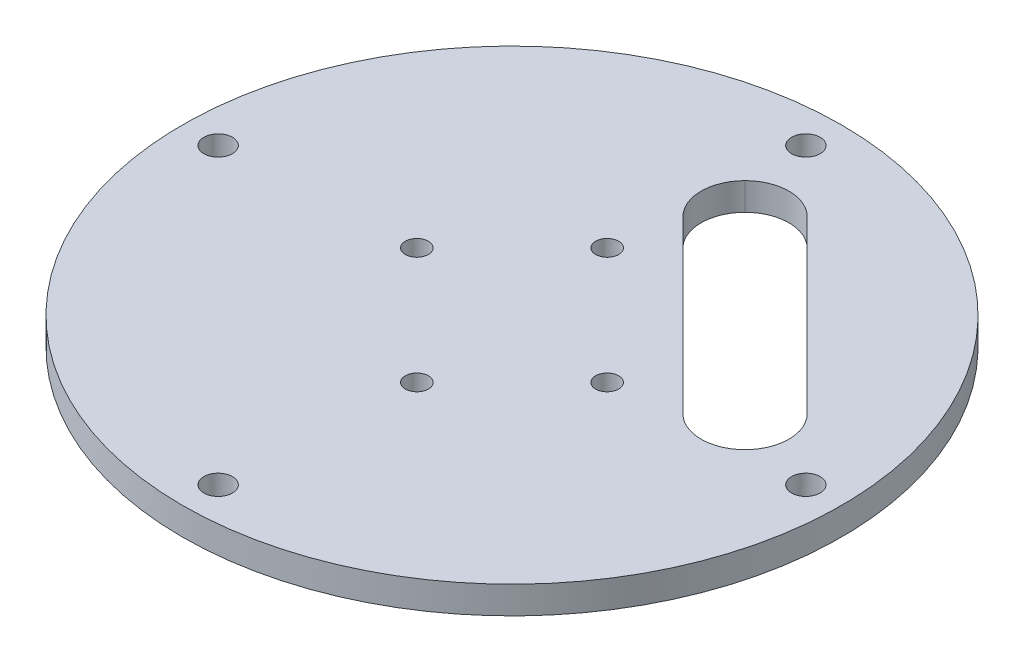
ISO-10303-21;
HEADER;
FILE_DESCRIPTION(('STEP AP214'),'2;1');
FILE_NAME('part.step','',(''),(''),'','','');
FILE_SCHEMA(('AUTOMOTIVE_DESIGN { 1 0 10303 214 1 1 1 1 }'));
ENDSEC;
DATA;
#1=APPLICATION_CONTEXT('core data for automotive mechanical design processes');
#2=APPLICATION_PROTOCOL_DEFINITION('international standard','automotive_design',2000,#1);
#3=PRODUCT_CONTEXT('',#1,'mechanical');
#4=PRODUCT('Part','Part','',(#3));
#5=PRODUCT_RELATED_PRODUCT_CATEGORY('part','',(#4));
#6=PRODUCT_DEFINITION_FORMATION('','',#4);
#7=PRODUCT_DEFINITION_CONTEXT('part definition',#1,'design');
#8=PRODUCT_DEFINITION('design','',#6,#7);
#9=PRODUCT_DEFINITION_SHAPE('','',#8);
#10=(LENGTH_UNIT() NAMED_UNIT(*) SI_UNIT(.MILLI.,.METRE.));
#11=(NAMED_UNIT(*) PLANE_ANGLE_UNIT() SI_UNIT($,.RADIAN.));
#12=(NAMED_UNIT(*) SI_UNIT($,.STERADIAN.) SOLID_ANGLE_UNIT());
#13=UNCERTAINTY_MEASURE_WITH_UNIT(LENGTH_MEASURE(1.E-05),#10,'distance_accuracy_value','');
#14=(GEOMETRIC_REPRESENTATION_CONTEXT(3) GLOBAL_UNCERTAINTY_ASSIGNED_CONTEXT((#13)) GLOBAL_UNIT_ASSIGNED_CONTEXT((#10,
#11,#12)) REPRESENTATION_CONTEXT('',''));
#15=CARTESIAN_POINT('',(0.,0.,0.));
#16=DIRECTION('',(0.,0.,1.));
#17=DIRECTION('',(1.,0.,0.));
#18=AXIS2_PLACEMENT_3D('',#15,#16,#17);
#19=CARTESIAN_POINT('',(0.,5.,0.));
#20=DIRECTION('',(0.,1.,0.));
#21=DIRECTION('',(0.,0.,1.));
#22=AXIS2_PLACEMENT_3D('',#19,#20,#21);
#23=PLANE('',#22);
#24=DIRECTION('',(0.707106781186549,0.,0.707106781186546));
#25=VECTOR('',#24,1.);
#26=CARTESIAN_POINT('',(-5.65685424949306,5.,-36.7695526217011));
#27=LINE('',#26,#25);
#28=CARTESIAN_POINT('',(-6.69603261727048E-13,5.,-31.1126983722087));
#29=VERTEX_POINT('',#28);
#30=CARTESIAN_POINT('',(31.1126983722081,5.,0.));
#31=VERTEX_POINT('',#30);
#32=EDGE_CURVE('E150',#29,#31,#27,.T.);
#33=ORIENTED_EDGE('',*,*,#32,.F.);
#34=CARTESIAN_POINT('',(5.6568542494917,5.,-36.7695526217011));
#35=DIRECTION('',(0.,1.,0.));
#36=DIRECTION('',(0.,0.,1.));
#37=AXIS2_PLACEMENT_3D('',#34,#35,#36);
#38=CIRCLE('',#37,8.);
#39=CARTESIAN_POINT('',(-6.83481049534862E-13,5.,-42.4264068711935));
#40=VERTEX_POINT('',#39);
#41=EDGE_CURVE('E11',#29,#40,#38,.F.);
#42=ORIENTED_EDGE('',*,*,#41,.T.);
#43=CARTESIAN_POINT('',(5.65685424949171,5.,-36.7695526217011));
#44=DIRECTION('',(0.,1.,0.));
#45=DIRECTION('',(0.,0.,1.));
#46=AXIS2_PLACEMENT_3D('',#43,#44,#45);
#47=CIRCLE('',#46,8.);
#48=CARTESIAN_POINT('',(11.3137084989841,5.,-42.4264068711935));
#49=VERTEX_POINT('',#48);
#50=EDGE_CURVE('E94',#40,#49,#47,.F.);
#51=ORIENTED_EDGE('',*,*,#50,.T.);
#52=DIRECTION('',(-0.707106781186549,0.,-0.707106781186546));
#53=VECTOR('',#52,1.);
#54=CARTESIAN_POINT('',(5.65685424949169,5.,-48.0832611206859));
#55=LINE('',#54,#53);
#56=CARTESIAN_POINT('',(42.4264068711928,5.,-11.3137084989848));
#57=VERTEX_POINT('',#56);
#58=EDGE_CURVE('E143',#57,#49,#55,.T.);
#59=ORIENTED_EDGE('',*,*,#58,.F.);
#60=CARTESIAN_POINT('',(36.7695526217005,5.,-5.65685424949246));
#61=DIRECTION('',(0.,1.,0.));
#62=DIRECTION('',(0.,0.,1.));
#63=AXIS2_PLACEMENT_3D('',#60,#61,#62);
#64=CIRCLE('',#63,8.);
#65=CARTESIAN_POINT('',(42.4264068711928,5.,0.));
#66=VERTEX_POINT('',#65);
#67=EDGE_CURVE('E125',#57,#66,#64,.F.);
#68=ORIENTED_EDGE('',*,*,#67,.T.);
#69=CARTESIAN_POINT('',(36.7695526217004,5.,-5.65685424949245));
#70=DIRECTION('',(0.,1.,0.));
#71=DIRECTION('',(0.,0.,1.));
#72=AXIS2_PLACEMENT_3D('',#69,#70,#71);
#73=CIRCLE('',#72,8.);
#74=EDGE_CURVE('E121',#66,#31,#73,.F.);
#75=ORIENTED_EDGE('',*,*,#74,.T.);
#76=EDGE_LOOP('',(#33,#42,#51,#59,#68,#75));
#77=FACE_BOUND('',#76,.T.);
#78=CARTESIAN_POINT('',(1.94454364826355,5.,19.2686597873333));
#79=DIRECTION('',(0.,1.,0.));
#80=DIRECTION('',(0.,0.,1.));
#81=AXIS2_PLACEMENT_3D('',#78,#79,#80);
#82=CIRCLE('',#81,2.1);
#83=CARTESIAN_POINT('',(1.94454364826355,5.,21.3686597873333));
#84=VERTEX_POINT('',#83);
#85=EDGE_CURVE('E153',#84,#84,#82,.T.);
#86=ORIENTED_EDGE('',*,*,#85,.F.);
#87=EDGE_LOOP('',(#86));
#88=FACE_BOUND('',#87,.T.);
#89=CARTESIAN_POINT('',(-1.94454364826314,5.,-19.2686597873333));
#90=DIRECTION('',(0.,1.,0.));
#91=DIRECTION('',(0.,0.,1.));
#92=AXIS2_PLACEMENT_3D('',#89,#90,#91);
#93=CIRCLE('',#92,2.1);
#94=CARTESIAN_POINT('',(-1.94454364826314,5.,-17.1686597873333));
#95=VERTEX_POINT('',#94);
#96=EDGE_CURVE('E167',#95,#95,#93,.T.);
#97=ORIENTED_EDGE('',*,*,#96,.F.);
#98=EDGE_LOOP('',(#97));
#99=FACE_BOUND('',#98,.T.);
#100=CARTESIAN_POINT('',(0.,5.,53.5));
#101=DIRECTION('',(0.,1.,0.));
#102=DIRECTION('',(0.,0.,-1.));
#103=AXIS2_PLACEMENT_3D('',#100,#101,#102);
#104=CIRCLE('',#103,2.6);
#105=CARTESIAN_POINT('',(0.,5.,50.9));
#106=VERTEX_POINT('',#105);
#107=EDGE_CURVE('E179',#106,#106,#104,.T.);
#108=ORIENTED_EDGE('',*,*,#107,.F.);
#109=EDGE_LOOP('',(#108));
#110=FACE_BOUND('',#109,.T.);
#111=CARTESIAN_POINT('',(0.,5.,-53.5));
#112=DIRECTION('',(0.,1.,0.));
#113=DIRECTION('',(0.,0.,1.));
#114=AXIS2_PLACEMENT_3D('',#111,#112,#113);
#115=CIRCLE('',#114,2.6);
#116=CARTESIAN_POINT('',(0.,5.,-50.9));
#117=VERTEX_POINT('',#116);
#118=EDGE_CURVE('E191',#117,#117,#115,.T.);
#119=ORIENTED_EDGE('',*,*,#118,.F.);
#120=EDGE_LOOP('',(#119));
#121=FACE_BOUND('',#120,.T.);
#122=CARTESIAN_POINT('',(0.,5.,0.));
#123=DIRECTION('',(0.,1.,0.));
#124=DIRECTION('',(0.,0.,1.));
#125=AXIS2_PLACEMENT_3D('',#122,#123,#124);
#126=CIRCLE('',#125,60.);
#127=CARTESIAN_POINT('',(0.,5.,60.));
#128=VERTEX_POINT('',#127);
#129=EDGE_CURVE('E106',#128,#128,#126,.T.);
#130=ORIENTED_EDGE('',*,*,#129,.T.);
#131=EDGE_LOOP('',(#130));
#132=FACE_BOUND('',#131,.T.);
#133=CARTESIAN_POINT('',(53.5,5.,-1.80411241501588E-13));
#134=DIRECTION('',(0.,1.,0.));
#135=DIRECTION('',(0.,0.,-1.));
#136=AXIS2_PLACEMENT_3D('',#133,#134,#135);
#137=CIRCLE('',#136,2.6);
#138=CARTESIAN_POINT('',(53.5,5.,-2.60000000000018));
#139=VERTEX_POINT('',#138);
#140=EDGE_CURVE('E185',#139,#139,#137,.T.);
#141=ORIENTED_EDGE('',*,*,#140,.F.);
#142=EDGE_LOOP('',(#141));
#143=FACE_BOUND('',#142,.T.);
#144=CARTESIAN_POINT('',(-53.5,5.,-1.80411241501588E-13));
#145=DIRECTION('',(0.,1.,0.));
#146=DIRECTION('',(0.,0.,1.));
#147=AXIS2_PLACEMENT_3D('',#144,#145,#146);
#148=CIRCLE('',#147,2.6);
#149=CARTESIAN_POINT('',(-53.5,5.,2.59999999999982));
#150=VERTEX_POINT('',#149);
#151=EDGE_CURVE('E173',#150,#150,#148,.T.);
#152=ORIENTED_EDGE('',*,*,#151,.F.);
#153=EDGE_LOOP('',(#152));
#154=FACE_BOUND('',#153,.T.);
#155=CARTESIAN_POINT('',(19.2686597873333,5.,1.94454364826308));
#156=DIRECTION('',(0.,1.,0.));
#157=DIRECTION('',(0.,0.,-1.));
#158=AXIS2_PLACEMENT_3D('',#155,#156,#157);
#159=CIRCLE('',#158,2.1);
#160=CARTESIAN_POINT('',(19.2686597873333,5.,-0.155456351736919));
#161=VERTEX_POINT('',#160);
#162=EDGE_CURVE('E161',#161,#161,#159,.T.);
#163=ORIENTED_EDGE('',*,*,#162,.F.);
#164=EDGE_LOOP('',(#163));
#165=FACE_BOUND('',#164,.T.);
#166=CARTESIAN_POINT('',(-19.2686597873334,5.,-1.94454364826267));
#167=DIRECTION('',(0.,1.,0.));
#168=DIRECTION('',(0.,0.,-1.));
#169=AXIS2_PLACEMENT_3D('',#166,#167,#168);
#170=CIRCLE('',#169,2.1);
#171=CARTESIAN_POINT('',(-19.2686597873334,5.,-4.04454364826267));
#172=VERTEX_POINT('',#171);
#173=EDGE_CURVE('E104',#172,#172,#170,.T.);
#174=ORIENTED_EDGE('',*,*,#173,.F.);
#175=EDGE_LOOP('',(#174));
#176=FACE_BOUND('',#175,.T.);
#177=ADVANCED_FACE('F35',(#77,#88,#99,#110,#121,#132,#143,#154,#165,#176),#23,.T.);
#178=CARTESIAN_POINT('',(0.,0.,0.));
#179=DIRECTION('',(0.,1.,0.));
#180=DIRECTION('',(0.,0.,1.));
#181=AXIS2_PLACEMENT_3D('',#178,#179,#180);
#182=PLANE('',#181);
#183=CARTESIAN_POINT('',(1.94454364826355,0.,19.2686597873333));
#184=DIRECTION('',(0.,1.,0.));
#185=DIRECTION('',(0.,0.,1.));
#186=AXIS2_PLACEMENT_3D('',#183,#184,#185);
#187=CIRCLE('',#186,2.1);
#188=CARTESIAN_POINT('',(1.94454364826355,0.,21.3686597873333));
#189=VERTEX_POINT('',#188);
#190=EDGE_CURVE('E149',#189,#189,#187,.T.);
#191=ORIENTED_EDGE('',*,*,#190,.T.);
#192=EDGE_LOOP('',(#191));
#193=FACE_BOUND('',#192,.T.);
#194=CARTESIAN_POINT('',(19.2686597873333,0.,1.94454364826308));
#195=DIRECTION('',(0.,1.,0.));
#196=DIRECTION('',(0.,0.,-1.));
#197=AXIS2_PLACEMENT_3D('',#194,#195,#196);
#198=CIRCLE('',#197,2.1);
#199=CARTESIAN_POINT('',(19.2686597873333,0.,-0.155456351736919));
#200=VERTEX_POINT('',#199);
#201=EDGE_CURVE('E159',#200,#200,#198,.T.);
#202=ORIENTED_EDGE('',*,*,#201,.T.);
#203=EDGE_LOOP('',(#202));
#204=FACE_BOUND('',#203,.T.);
#205=CARTESIAN_POINT('',(-1.94454364826314,0.,-19.2686597873333));
#206=DIRECTION('',(0.,1.,0.));
#207=DIRECTION('',(0.,0.,1.));
#208=AXIS2_PLACEMENT_3D('',#205,#206,#207);
#209=CIRCLE('',#208,2.1);
#210=CARTESIAN_POINT('',(-1.94454364826314,0.,-17.1686597873333));
#211=VERTEX_POINT('',#210);
#212=EDGE_CURVE('E164',#211,#211,#209,.T.);
#213=ORIENTED_EDGE('',*,*,#212,.T.);
#214=EDGE_LOOP('',(#213));
#215=FACE_BOUND('',#214,.T.);
#216=CARTESIAN_POINT('',(-53.5,0.,-1.80411241501588E-13));
#217=DIRECTION('',(0.,1.,0.));
#218=DIRECTION('',(0.,0.,1.));
#219=AXIS2_PLACEMENT_3D('',#216,#217,#218);
#220=CIRCLE('',#219,2.6);
#221=CARTESIAN_POINT('',(-53.5,0.,2.59999999999982));
#222=VERTEX_POINT('',#221);
#223=EDGE_CURVE('E170',#222,#222,#220,.T.);
#224=ORIENTED_EDGE('',*,*,#223,.T.);
#225=EDGE_LOOP('',(#224));
#226=FACE_BOUND('',#225,.T.);
#227=CARTESIAN_POINT('',(0.,0.,53.5));
#228=DIRECTION('',(0.,1.,0.));
#229=DIRECTION('',(0.,0.,-1.));
#230=AXIS2_PLACEMENT_3D('',#227,#228,#229);
#231=CIRCLE('',#230,2.6);
#232=CARTESIAN_POINT('',(0.,0.,50.9));
#233=VERTEX_POINT('',#232);
#234=EDGE_CURVE('E176',#233,#233,#231,.T.);
#235=ORIENTED_EDGE('',*,*,#234,.T.);
#236=EDGE_LOOP('',(#235));
#237=FACE_BOUND('',#236,.T.);
#238=CARTESIAN_POINT('',(53.5,0.,-1.80411241501588E-13));
#239=DIRECTION('',(0.,1.,0.));
#240=DIRECTION('',(0.,0.,-1.));
#241=AXIS2_PLACEMENT_3D('',#238,#239,#240);
#242=CIRCLE('',#241,2.6);
#243=CARTESIAN_POINT('',(53.5,0.,-2.60000000000018));
#244=VERTEX_POINT('',#243);
#245=EDGE_CURVE('E182',#244,#244,#242,.T.);
#246=ORIENTED_EDGE('',*,*,#245,.T.);
#247=EDGE_LOOP('',(#246));
#248=FACE_BOUND('',#247,.T.);
#249=CARTESIAN_POINT('',(0.,0.,-53.5));
#250=DIRECTION('',(0.,1.,0.));
#251=DIRECTION('',(0.,0.,1.));
#252=AXIS2_PLACEMENT_3D('',#249,#250,#251);
#253=CIRCLE('',#252,2.6);
#254=CARTESIAN_POINT('',(0.,0.,-50.9));
#255=VERTEX_POINT('',#254);
#256=EDGE_CURVE('E188',#255,#255,#253,.T.);
#257=ORIENTED_EDGE('',*,*,#256,.T.);
#258=EDGE_LOOP('',(#257));
#259=FACE_BOUND('',#258,.T.);
#260=CARTESIAN_POINT('',(0.,0.,0.));
#261=DIRECTION('',(0.,1.,0.));
#262=DIRECTION('',(0.,0.,1.));
#263=AXIS2_PLACEMENT_3D('',#260,#261,#262);
#264=CIRCLE('',#263,60.);
#265=CARTESIAN_POINT('',(0.,0.,60.));
#266=VERTEX_POINT('',#265);
#267=EDGE_CURVE('E111',#266,#266,#264,.T.);
#268=ORIENTED_EDGE('',*,*,#267,.F.);
#269=EDGE_LOOP('',(#268));
#270=FACE_BOUND('',#269,.T.);
#271=CARTESIAN_POINT('',(5.65685424949171,0.,-36.7695526217011));
#272=DIRECTION('',(0.,1.,0.));
#273=DIRECTION('',(0.,0.,1.));
#274=AXIS2_PLACEMENT_3D('',#271,#272,#273);
#275=CIRCLE('',#274,8.);
#276=CARTESIAN_POINT('',(11.3137084989841,0.,-42.4264068711935));
#277=VERTEX_POINT('',#276);
#278=CARTESIAN_POINT('',(-6.83481049534862E-13,0.,-42.4264068711935));
#279=VERTEX_POINT('',#278);
#280=EDGE_CURVE('E58',#277,#279,#275,.T.);
#281=ORIENTED_EDGE('',*,*,#280,.T.);
#282=CARTESIAN_POINT('',(5.6568542494917,0.,-36.7695526217011));
#283=DIRECTION('',(0.,1.,0.));
#284=DIRECTION('',(0.,0.,1.));
#285=AXIS2_PLACEMENT_3D('',#282,#283,#284);
#286=CIRCLE('',#285,8.);
#287=CARTESIAN_POINT('',(-6.69603261727048E-13,0.,-31.1126983722087));
#288=VERTEX_POINT('',#287);
#289=EDGE_CURVE('E44',#279,#288,#286,.T.);
#290=ORIENTED_EDGE('',*,*,#289,.T.);
#291=DIRECTION('',(0.707106781186549,0.,0.707106781186546));
#292=VECTOR('',#291,1.);
#293=CARTESIAN_POINT('',(-5.65685424949306,0.,-36.7695526217011));
#294=LINE('',#293,#292);
#295=CARTESIAN_POINT('',(31.1126983722081,0.,0.));
#296=VERTEX_POINT('',#295);
#297=EDGE_CURVE('E90',#288,#296,#294,.T.);
#298=ORIENTED_EDGE('',*,*,#297,.T.);
#299=CARTESIAN_POINT('',(36.7695526217004,0.,-5.65685424949245));
#300=DIRECTION('',(0.,1.,0.));
#301=DIRECTION('',(0.,0.,1.));
#302=AXIS2_PLACEMENT_3D('',#299,#300,#301);
#303=CIRCLE('',#302,8.);
#304=CARTESIAN_POINT('',(42.4264068711928,0.,0.));
#305=VERTEX_POINT('',#304);
#306=EDGE_CURVE('E119',#296,#305,#303,.T.);
#307=ORIENTED_EDGE('',*,*,#306,.T.);
#308=CARTESIAN_POINT('',(36.7695526217005,0.,-5.65685424949246));
#309=DIRECTION('',(0.,1.,0.));
#310=DIRECTION('',(0.,0.,1.));
#311=AXIS2_PLACEMENT_3D('',#308,#309,#310);
#312=CIRCLE('',#311,8.);
#313=CARTESIAN_POINT('',(42.4264068711928,0.,-11.3137084989848));
#314=VERTEX_POINT('',#313);
#315=EDGE_CURVE('E123',#305,#314,#312,.T.);
#316=ORIENTED_EDGE('',*,*,#315,.T.);
#317=DIRECTION('',(-0.707106781186549,0.,-0.707106781186546));
#318=VECTOR('',#317,1.);
#319=CARTESIAN_POINT('',(5.65685424949169,0.,-48.0832611206859));
#320=LINE('',#319,#318);
#321=EDGE_CURVE('E103',#314,#277,#320,.T.);
#322=ORIENTED_EDGE('',*,*,#321,.T.);
#323=EDGE_LOOP('',(#281,#290,#298,#307,#316,#322));
#324=FACE_BOUND('',#323,.T.);
#325=CARTESIAN_POINT('',(-19.2686597873334,0.,-1.94454364826267));
#326=DIRECTION('',(0.,1.,0.));
#327=DIRECTION('',(0.,0.,-1.));
#328=AXIS2_PLACEMENT_3D('',#325,#326,#327);
#329=CIRCLE('',#328,2.1);
#330=CARTESIAN_POINT('',(-19.2686597873334,0.,-4.04454364826267));
#331=VERTEX_POINT('',#330);
#332=EDGE_CURVE('E130',#331,#331,#329,.T.);
#333=ORIENTED_EDGE('',*,*,#332,.T.);
#334=EDGE_LOOP('',(#333));
#335=FACE_BOUND('',#334,.T.);
#336=ADVANCED_FACE('F88',(#193,#204,#215,#226,#237,#248,#259,#270,#324,#335),#182,.F.);
#337=CARTESIAN_POINT('',(0.,5.,0.));
#338=DIRECTION('',(0.,-1.,0.));
#339=DIRECTION('',(0.,0.,-1.));
#340=AXIS2_PLACEMENT_3D('',#337,#338,#339);
#341=CYLINDRICAL_SURFACE('',#340,60.);
#342=ORIENTED_EDGE('',*,*,#129,.F.);
#343=EDGE_LOOP('',(#342));
#344=FACE_BOUND('',#343,.T.);
#345=ORIENTED_EDGE('',*,*,#267,.T.);
#346=EDGE_LOOP('',(#345));
#347=FACE_BOUND('',#346,.T.);
#348=ADVANCED_FACE('F202',(#344,#347),#341,.T.);
#349=CARTESIAN_POINT('',(0.,5.,-53.5));
#350=DIRECTION('',(0.,-1.,0.));
#351=DIRECTION('',(0.,0.,-1.));
#352=AXIS2_PLACEMENT_3D('',#349,#350,#351);
#353=CYLINDRICAL_SURFACE('',#352,2.6);
#354=ORIENTED_EDGE('',*,*,#118,.T.);
#355=EDGE_LOOP('',(#354));
#356=FACE_BOUND('',#355,.T.);
#357=ORIENTED_EDGE('',*,*,#256,.F.);
#358=EDGE_LOOP('',(#357));
#359=FACE_BOUND('',#358,.T.);
#360=ADVANCED_FACE('F199',(#356,#359),#353,.F.);
#361=CARTESIAN_POINT('',(53.5,5.,-1.80411241501588E-13));
#362=DIRECTION('',(0.,-1.,0.));
#363=DIRECTION('',(0.,0.,-1.));
#364=AXIS2_PLACEMENT_3D('',#361,#362,#363);
#365=CYLINDRICAL_SURFACE('',#364,2.6);
#366=ORIENTED_EDGE('',*,*,#140,.T.);
#367=EDGE_LOOP('',(#366));
#368=FACE_BOUND('',#367,.T.);
#369=ORIENTED_EDGE('',*,*,#245,.F.);
#370=EDGE_LOOP('',(#369));
#371=FACE_BOUND('',#370,.T.);
#372=ADVANCED_FACE('F201',(#368,#371),#365,.F.);
#373=CARTESIAN_POINT('',(0.,5.,53.5));
#374=DIRECTION('',(0.,-1.,0.));
#375=DIRECTION('',(0.,0.,-1.));
#376=AXIS2_PLACEMENT_3D('',#373,#374,#375);
#377=CYLINDRICAL_SURFACE('',#376,2.6);
#378=ORIENTED_EDGE('',*,*,#107,.T.);
#379=EDGE_LOOP('',(#378));
#380=FACE_BOUND('',#379,.T.);
#381=ORIENTED_EDGE('',*,*,#234,.F.);
#382=EDGE_LOOP('',(#381));
#383=FACE_BOUND('',#382,.T.);
#384=ADVANCED_FACE('F209',(#380,#383),#377,.F.);
#385=CARTESIAN_POINT('',(-53.5,5.,-1.80411241501588E-13));
#386=DIRECTION('',(0.,-1.,0.));
#387=DIRECTION('',(0.,0.,-1.));
#388=AXIS2_PLACEMENT_3D('',#385,#386,#387);
#389=CYLINDRICAL_SURFACE('',#388,2.6);
#390=ORIENTED_EDGE('',*,*,#151,.T.);
#391=EDGE_LOOP('',(#390));
#392=FACE_BOUND('',#391,.T.);
#393=ORIENTED_EDGE('',*,*,#223,.F.);
#394=EDGE_LOOP('',(#393));
#395=FACE_BOUND('',#394,.T.);
#396=ADVANCED_FACE('F286',(#392,#395),#389,.F.);
#397=CARTESIAN_POINT('',(-1.94454364826314,5.,-19.2686597873333));
#398=DIRECTION('',(0.,-1.,0.));
#399=DIRECTION('',(0.,0.,-1.));
#400=AXIS2_PLACEMENT_3D('',#397,#398,#399);
#401=CYLINDRICAL_SURFACE('',#400,2.1);
#402=ORIENTED_EDGE('',*,*,#96,.T.);
#403=EDGE_LOOP('',(#402));
#404=FACE_BOUND('',#403,.T.);
#405=ORIENTED_EDGE('',*,*,#212,.F.);
#406=EDGE_LOOP('',(#405));
#407=FACE_BOUND('',#406,.T.);
#408=ADVANCED_FACE('F278',(#404,#407),#401,.F.);
#409=CARTESIAN_POINT('',(19.2686597873333,5.,1.94454364826308));
#410=DIRECTION('',(0.,-1.,0.));
#411=DIRECTION('',(0.,0.,-1.));
#412=AXIS2_PLACEMENT_3D('',#409,#410,#411);
#413=CYLINDRICAL_SURFACE('',#412,2.1);
#414=ORIENTED_EDGE('',*,*,#162,.T.);
#415=EDGE_LOOP('',(#414));
#416=FACE_BOUND('',#415,.T.);
#417=ORIENTED_EDGE('',*,*,#201,.F.);
#418=EDGE_LOOP('',(#417));
#419=FACE_BOUND('',#418,.T.);
#420=ADVANCED_FACE('F270',(#416,#419),#413,.F.);
#421=CARTESIAN_POINT('',(1.94454364826355,5.,19.2686597873333));
#422=DIRECTION('',(0.,-1.,0.));
#423=DIRECTION('',(0.,0.,-1.));
#424=AXIS2_PLACEMENT_3D('',#421,#422,#423);
#425=CYLINDRICAL_SURFACE('',#424,2.1);
#426=ORIENTED_EDGE('',*,*,#85,.T.);
#427=EDGE_LOOP('',(#426));
#428=FACE_BOUND('',#427,.T.);
#429=ORIENTED_EDGE('',*,*,#190,.F.);
#430=EDGE_LOOP('',(#429));
#431=FACE_BOUND('',#430,.T.);
#432=ADVANCED_FACE('F263',(#428,#431),#425,.F.);
#433=CARTESIAN_POINT('',(-5.65685424949306,5.,-36.7695526217011));
#434=DIRECTION('',(0.707106781186546,0.,-0.707106781186549));
#435=DIRECTION('',(-0.707106781186549,0.,-0.707106781186546));
#436=AXIS2_PLACEMENT_3D('',#433,#434,#435);
#437=PLANE('',#436);
#438=ORIENTED_EDGE('',*,*,#32,.T.);
#439=DIRECTION('',(0.,-1.,0.));
#440=VECTOR('',#439,1.);
#441=CARTESIAN_POINT('',(31.1126983722081,0.,0.));
#442=LINE('',#441,#440);
#443=EDGE_CURVE('E102',#31,#296,#442,.T.);
#444=ORIENTED_EDGE('',*,*,#443,.T.);
#445=ORIENTED_EDGE('',*,*,#297,.F.);
#446=DIRECTION('',(0.,-1.,0.));
#447=VECTOR('',#446,1.);
#448=CARTESIAN_POINT('',(-6.67868538251071E-13,5.,-31.1126983722087));
#449=LINE('',#448,#447);
#450=EDGE_CURVE('E100',#288,#29,#449,.F.);
#451=ORIENTED_EDGE('',*,*,#450,.T.);
#452=EDGE_LOOP('',(#438,#444,#445,#451));
#453=FACE_BOUND('',#452,.T.);
#454=ADVANCED_FACE('F99',(#453),#437,.T.);
#455=CARTESIAN_POINT('',(5.65685424949169,5.,-48.0832611206859));
#456=DIRECTION('',(-0.707106781186546,0.,0.707106781186549));
#457=DIRECTION('',(0.707106781186549,0.,0.707106781186546));
#458=AXIS2_PLACEMENT_3D('',#455,#456,#457);
#459=PLANE('',#458);
#460=ORIENTED_EDGE('',*,*,#321,.F.);
#461=DIRECTION('',(0.,-1.,0.));
#462=VECTOR('',#461,1.);
#463=CARTESIAN_POINT('',(42.4264068711928,5.,-11.3137084989848));
#464=LINE('',#463,#462);
#465=EDGE_CURVE('E117',#314,#57,#464,.F.);
#466=ORIENTED_EDGE('',*,*,#465,.T.);
#467=ORIENTED_EDGE('',*,*,#58,.T.);
#468=DIRECTION('',(0.,-1.,0.));
#469=VECTOR('',#468,1.);
#470=CARTESIAN_POINT('',(11.3137084989841,0.,-42.4264068711935));
#471=LINE('',#470,#469);
#472=EDGE_CURVE('E108',#49,#277,#471,.T.);
#473=ORIENTED_EDGE('',*,*,#472,.T.);
#474=EDGE_LOOP('',(#460,#466,#467,#473));
#475=FACE_BOUND('',#474,.T.);
#476=ADVANCED_FACE('F147',(#475),#459,.T.);
#477=CARTESIAN_POINT('',(-19.2686597873334,5.,-1.94454364826267));
#478=DIRECTION('',(0.,-1.,0.));
#479=DIRECTION('',(0.,0.,-1.));
#480=AXIS2_PLACEMENT_3D('',#477,#478,#479);
#481=CYLINDRICAL_SURFACE('',#480,2.1);
#482=ORIENTED_EDGE('',*,*,#173,.T.);
#483=EDGE_LOOP('',(#482));
#484=FACE_BOUND('',#483,.T.);
#485=ORIENTED_EDGE('',*,*,#332,.F.);
#486=EDGE_LOOP('',(#485));
#487=FACE_BOUND('',#486,.T.);
#488=ADVANCED_FACE('F227',(#484,#487),#481,.F.);
#489=CARTESIAN_POINT('',(36.7695526217005,5.,-5.65685424949246));
#490=DIRECTION('',(0.,1.,0.));
#491=DIRECTION('',(0.,0.,1.));
#492=AXIS2_PLACEMENT_3D('',#489,#490,#491);
#493=CYLINDRICAL_SURFACE('',#492,8.);
#494=DIRECTION('',(0.,-1.,0.));
#495=VECTOR('',#494,1.);
#496=CARTESIAN_POINT('',(42.4264068711928,0.,0.));
#497=LINE('',#496,#495);
#498=EDGE_CURVE('E128',#66,#305,#497,.T.);
#499=ORIENTED_EDGE('',*,*,#498,.F.);
#500=ORIENTED_EDGE('',*,*,#67,.F.);
#501=ORIENTED_EDGE('',*,*,#465,.F.);
#502=ORIENTED_EDGE('',*,*,#315,.F.);
#503=EDGE_LOOP('',(#499,#500,#501,#502));
#504=FACE_BOUND('',#503,.T.);
#505=ADVANCED_FACE('F225',(#504),#493,.F.);
#506=CARTESIAN_POINT('',(36.7695526217004,5.,-5.65685424949245));
#507=DIRECTION('',(0.,1.,0.));
#508=DIRECTION('',(0.,0.,1.));
#509=AXIS2_PLACEMENT_3D('',#506,#507,#508);
#510=CYLINDRICAL_SURFACE('',#509,8.);
#511=ORIENTED_EDGE('',*,*,#74,.F.);
#512=ORIENTED_EDGE('',*,*,#498,.T.);
#513=ORIENTED_EDGE('',*,*,#306,.F.);
#514=ORIENTED_EDGE('',*,*,#443,.F.);
#515=EDGE_LOOP('',(#511,#512,#513,#514));
#516=FACE_BOUND('',#515,.T.);
#517=ADVANCED_FACE('F222',(#516),#510,.F.);
#518=CARTESIAN_POINT('',(5.6568542494917,5.,-36.7695526217011));
#519=DIRECTION('',(0.,1.,0.));
#520=DIRECTION('',(0.,0.,1.));
#521=AXIS2_PLACEMENT_3D('',#518,#519,#520);
#522=CYLINDRICAL_SURFACE('',#521,8.);
#523=DIRECTION('',(0.,-1.,0.));
#524=VECTOR('',#523,1.);
#525=CARTESIAN_POINT('',(-6.86083134748827E-13,0.,-42.4264068711935));
#526=LINE('',#525,#524);
#527=EDGE_CURVE('E39',#40,#279,#526,.T.);
#528=ORIENTED_EDGE('',*,*,#527,.F.);
#529=ORIENTED_EDGE('',*,*,#41,.F.);
#530=ORIENTED_EDGE('',*,*,#450,.F.);
#531=ORIENTED_EDGE('',*,*,#289,.F.);
#532=EDGE_LOOP('',(#528,#529,#530,#531));
#533=FACE_BOUND('',#532,.T.);
#534=ADVANCED_FACE('F37',(#533),#522,.F.);
#535=CARTESIAN_POINT('',(5.65685424949171,5.,-36.7695526217011));
#536=DIRECTION('',(0.,1.,0.));
#537=DIRECTION('',(0.,0.,1.));
#538=AXIS2_PLACEMENT_3D('',#535,#536,#537);
#539=CYLINDRICAL_SURFACE('',#538,8.);
#540=ORIENTED_EDGE('',*,*,#50,.F.);
#541=ORIENTED_EDGE('',*,*,#527,.T.);
#542=ORIENTED_EDGE('',*,*,#280,.F.);
#543=ORIENTED_EDGE('',*,*,#472,.F.);
#544=EDGE_LOOP('',(#540,#541,#542,#543));
#545=FACE_BOUND('',#544,.T.);
#546=ADVANCED_FACE('F138',(#545),#539,.F.);
#547=CLOSED_SHELL('',(#177,#336,#348,#360,#372,#384,#396,#408,#420,#432,#454,#476,#488,#505,
#517,#534,#546));
#548=MANIFOLD_SOLID_BREP('B2',#547);
#549=ADVANCED_BREP_SHAPE_REPRESENTATION('',(#18,#548),#14);
#550=SHAPE_DEFINITION_REPRESENTATION(#9,#549);
ENDSEC;
END-ISO-10303-21;
